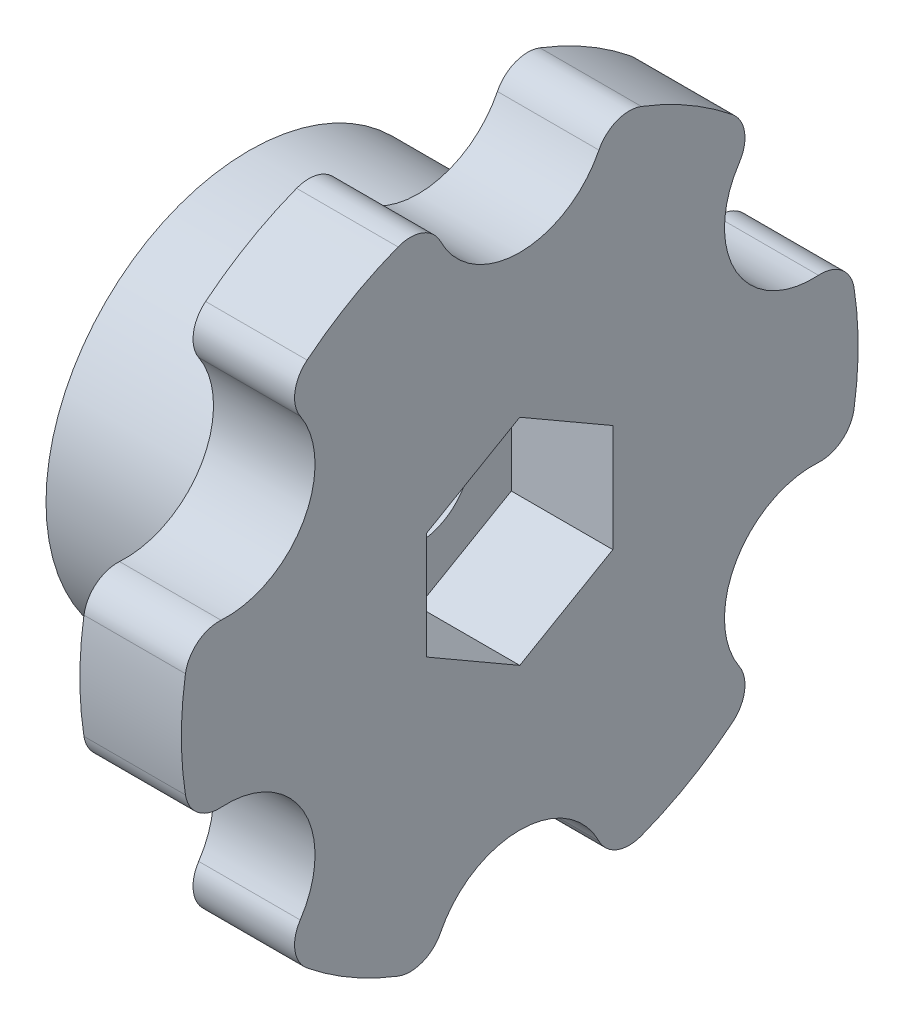
ISO-10303-21;
HEADER;
FILE_DESCRIPTION(('STEP AP214'),'2;1');
FILE_NAME('part.step','',(''),(''),'','','');
FILE_SCHEMA(('AUTOMOTIVE_DESIGN { 1 0 10303 214 1 1 1 1 }'));
ENDSEC;
DATA;
#1=APPLICATION_CONTEXT('core data for automotive mechanical design processes');
#2=APPLICATION_PROTOCOL_DEFINITION('international standard','automotive_design',2000,#1);
#3=PRODUCT_CONTEXT('',#1,'mechanical');
#4=PRODUCT('Part','Part','',(#3));
#5=PRODUCT_RELATED_PRODUCT_CATEGORY('part','',(#4));
#6=PRODUCT_DEFINITION_FORMATION('','',#4);
#7=PRODUCT_DEFINITION_CONTEXT('part definition',#1,'design');
#8=PRODUCT_DEFINITION('design','',#6,#7);
#9=PRODUCT_DEFINITION_SHAPE('','',#8);
#10=(LENGTH_UNIT() NAMED_UNIT(*) SI_UNIT(.MILLI.,.METRE.));
#11=(NAMED_UNIT(*) PLANE_ANGLE_UNIT() SI_UNIT($,.RADIAN.));
#12=(NAMED_UNIT(*) SI_UNIT($,.STERADIAN.) SOLID_ANGLE_UNIT());
#13=UNCERTAINTY_MEASURE_WITH_UNIT(LENGTH_MEASURE(1.E-05),#10,'distance_accuracy_value','');
#14=(GEOMETRIC_REPRESENTATION_CONTEXT(3) GLOBAL_UNCERTAINTY_ASSIGNED_CONTEXT((#13)) GLOBAL_UNIT_ASSIGNED_CONTEXT((#10,
#11,#12)) REPRESENTATION_CONTEXT('',''));
#15=CARTESIAN_POINT('',(0.,0.,0.));
#16=DIRECTION('',(0.,0.,1.));
#17=DIRECTION('',(1.,0.,0.));
#18=AXIS2_PLACEMENT_3D('',#15,#16,#17);
#19=CARTESIAN_POINT('',(8.,0.,0.));
#20=DIRECTION('',(-1.,0.,0.));
#21=DIRECTION('',(0.,0.,1.));
#22=AXIS2_PLACEMENT_3D('',#19,#20,#21);
#23=CYLINDRICAL_SURFACE('',#22,1.55);
#24=CARTESIAN_POINT('',(0.,0.,0.));
#25=DIRECTION('',(-1.,0.,0.));
#26=DIRECTION('',(0.,0.,1.));
#27=AXIS2_PLACEMENT_3D('',#24,#25,#26);
#28=CIRCLE('',#27,1.55);
#29=CARTESIAN_POINT('',(0.,0.,1.55));
#30=VERTEX_POINT('',#29);
#31=EDGE_CURVE('E307',#30,#30,#28,.T.);
#32=ORIENTED_EDGE('',*,*,#31,.T.);
#33=EDGE_LOOP('',(#32));
#34=FACE_BOUND('',#33,.T.);
#35=CARTESIAN_POINT('',(5.,0.,0.));
#36=DIRECTION('',(1.,0.,0.));
#37=DIRECTION('',(0.,0.,-1.));
#38=AXIS2_PLACEMENT_3D('',#35,#36,#37);
#39=CIRCLE('',#38,1.55);
#40=CARTESIAN_POINT('',(5.,0.,-1.55));
#41=VERTEX_POINT('',#40);
#42=EDGE_CURVE('E40',#41,#41,#39,.F.);
#43=ORIENTED_EDGE('',*,*,#42,.F.);
#44=EDGE_LOOP('',(#43));
#45=FACE_BOUND('',#44,.T.);
#46=ADVANCED_FACE('F36',(#34,#45),#23,.F.);
#47=CARTESIAN_POINT('',(0.,0.,0.));
#48=DIRECTION('',(-1.,0.,0.));
#49=DIRECTION('',(0.,0.,1.));
#50=AXIS2_PLACEMENT_3D('',#47,#48,#49);
#51=CYLINDRICAL_SURFACE('',#50,10.);
#52=CARTESIAN_POINT('',(8.,0.,0.));
#53=DIRECTION('',(-1.,0.,0.));
#54=DIRECTION('',(0.,0.,1.));
#55=AXIS2_PLACEMENT_3D('',#52,#53,#54);
#56=CIRCLE('',#55,10.);
#57=CARTESIAN_POINT('',(8.,1.55205912768914,-9.87882141068239));
#58=VERTEX_POINT('',#57);
#59=CARTESIAN_POINT('',(8.,-1.55205912768826,-9.87882141068253));
#60=VERTEX_POINT('',#59);
#61=EDGE_CURVE('E324',#58,#60,#56,.T.);
#62=ORIENTED_EDGE('',*,*,#61,.T.);
#63=DIRECTION('',(-1.,0.,0.));
#64=VECTOR('',#63,1.);
#65=CARTESIAN_POINT('',(0.,-1.55205912768826,-9.87882141068253));
#66=LINE('',#65,#64);
#67=CARTESIAN_POINT('',(5.,-1.55205912768826,-9.87882141068253));
#68=VERTEX_POINT('',#67);
#69=EDGE_CURVE('E439',#60,#68,#66,.T.);
#70=ORIENTED_EDGE('',*,*,#69,.T.);
#71=CARTESIAN_POINT('',(5.,0.,0.));
#72=DIRECTION('',(-1.,0.,0.));
#73=DIRECTION('',(0.,0.,1.));
#74=AXIS2_PLACEMENT_3D('',#71,#72,#73);
#75=CIRCLE('',#74,10.);
#76=CARTESIAN_POINT('',(5.,1.55205912768914,-9.87882141068239));
#77=VERTEX_POINT('',#76);
#78=EDGE_CURVE('E474',#77,#68,#75,.T.);
#79=ORIENTED_EDGE('',*,*,#78,.F.);
#80=DIRECTION('',(-1.,0.,0.));
#81=VECTOR('',#80,1.);
#82=CARTESIAN_POINT('',(0.,1.55205912768914,-9.87882141068239));
#83=LINE('',#82,#81);
#84=EDGE_CURVE('E436',#77,#58,#83,.F.);
#85=ORIENTED_EDGE('',*,*,#84,.T.);
#86=EDGE_LOOP('',(#62,#70,#79,#85));
#87=FACE_BOUND('',#86,.T.);
#88=ADVANCED_FACE('F518',(#87),#51,.T.);
#89=CARTESIAN_POINT('',(8.,-7.77928073725603,-6.28353333809547));
#90=VERTEX_POINT('',#89);
#91=CARTESIAN_POINT('',(8.,-9.33133986494464,-3.5952880725882));
#92=VERTEX_POINT('',#91);
#93=EDGE_CURVE('E321',#90,#92,#56,.T.);
#94=ORIENTED_EDGE('',*,*,#93,.T.);
#95=DIRECTION('',(-1.,0.,0.));
#96=VECTOR('',#95,1.);
#97=CARTESIAN_POINT('',(0.,-9.33133986494464,-3.5952880725882));
#98=LINE('',#97,#96);
#99=CARTESIAN_POINT('',(5.,-9.33133986494464,-3.5952880725882));
#100=VERTEX_POINT('',#99);
#101=EDGE_CURVE('E429',#92,#100,#98,.T.);
#102=ORIENTED_EDGE('',*,*,#101,.T.);
#103=CARTESIAN_POINT('',(5.,-7.77928073725603,-6.28353333809547));
#104=VERTEX_POINT('',#103);
#105=EDGE_CURVE('E476',#104,#100,#75,.T.);
#106=ORIENTED_EDGE('',*,*,#105,.F.);
#107=DIRECTION('',(-1.,0.,0.));
#108=VECTOR('',#107,1.);
#109=CARTESIAN_POINT('',(0.,-7.77928073725603,-6.28353333809547));
#110=LINE('',#109,#108);
#111=EDGE_CURVE('E426',#104,#90,#110,.F.);
#112=ORIENTED_EDGE('',*,*,#111,.T.);
#113=EDGE_LOOP('',(#94,#102,#106,#112));
#114=FACE_BOUND('',#113,.T.);
#115=ADVANCED_FACE('F503',(#114),#51,.T.);
#116=CARTESIAN_POINT('',(8.,-9.33133986494504,3.59528807258715));
#117=VERTEX_POINT('',#116);
#118=CARTESIAN_POINT('',(8.,-7.77928073725685,6.28353333809446));
#119=VERTEX_POINT('',#118);
#120=EDGE_CURVE('E325',#117,#119,#56,.T.);
#121=ORIENTED_EDGE('',*,*,#120,.T.);
#122=DIRECTION('',(-1.,0.,0.));
#123=VECTOR('',#122,1.);
#124=CARTESIAN_POINT('',(0.,-7.77928073725686,6.28353333809446));
#125=LINE('',#124,#123);
#126=CARTESIAN_POINT('',(5.,-7.77928073725685,6.28353333809446));
#127=VERTEX_POINT('',#126);
#128=EDGE_CURVE('E419',#119,#127,#125,.T.);
#129=ORIENTED_EDGE('',*,*,#128,.T.);
#130=CARTESIAN_POINT('',(5.,-9.33133986494505,3.59528807258715));
#131=VERTEX_POINT('',#130);
#132=EDGE_CURVE('E319',#131,#127,#75,.T.);
#133=ORIENTED_EDGE('',*,*,#132,.F.);
#134=DIRECTION('',(-1.,0.,0.));
#135=VECTOR('',#134,1.);
#136=CARTESIAN_POINT('',(0.,-9.33133986494505,3.59528807258715));
#137=LINE('',#136,#135);
#138=EDGE_CURVE('E416',#131,#117,#137,.F.);
#139=ORIENTED_EDGE('',*,*,#138,.T.);
#140=EDGE_LOOP('',(#121,#129,#133,#139));
#141=FACE_BOUND('',#140,.T.);
#142=ADVANCED_FACE('F487',(#141),#51,.T.);
#143=CARTESIAN_POINT('',(8.,-1.55205912768865,9.87882141068247));
#144=VERTEX_POINT('',#143);
#145=CARTESIAN_POINT('',(8.,1.55205912768835,9.87882141068252));
#146=VERTEX_POINT('',#145);
#147=EDGE_CURVE('E463',#144,#146,#56,.T.);
#148=ORIENTED_EDGE('',*,*,#147,.T.);
#149=DIRECTION('',(-1.,0.,0.));
#150=VECTOR('',#149,1.);
#151=CARTESIAN_POINT('',(0.,1.55205912768835,9.87882141068252));
#152=LINE('',#151,#150);
#153=CARTESIAN_POINT('',(5.,1.55205912768835,9.87882141068252));
#154=VERTEX_POINT('',#153);
#155=EDGE_CURVE('E409',#146,#154,#152,.T.);
#156=ORIENTED_EDGE('',*,*,#155,.T.);
#157=CARTESIAN_POINT('',(5.,-1.55205912768865,9.87882141068247));
#158=VERTEX_POINT('',#157);
#159=EDGE_CURVE('E316',#158,#154,#75,.T.);
#160=ORIENTED_EDGE('',*,*,#159,.F.);
#161=DIRECTION('',(-1.,0.,0.));
#162=VECTOR('',#161,1.);
#163=CARTESIAN_POINT('',(0.,-1.55205912768865,9.87882141068247));
#164=LINE('',#163,#162);
#165=EDGE_CURVE('E406',#158,#144,#164,.F.);
#166=ORIENTED_EDGE('',*,*,#165,.T.);
#167=EDGE_LOOP('',(#148,#156,#160,#166));
#168=FACE_BOUND('',#167,.T.);
#169=ADVANCED_FACE('F712',(#168),#51,.T.);
#170=CARTESIAN_POINT('',(8.,7.77928073725632,6.28353333809511));
#171=VERTEX_POINT('',#170);
#172=CARTESIAN_POINT('',(8.,9.33133986494509,3.59528807258704));
#173=VERTEX_POINT('',#172);
#174=EDGE_CURVE('E326',#171,#173,#56,.T.);
#175=ORIENTED_EDGE('',*,*,#174,.T.);
#176=DIRECTION('',(-1.,0.,0.));
#177=VECTOR('',#176,1.);
#178=CARTESIAN_POINT('',(0.,9.33133986494509,3.59528807258704));
#179=LINE('',#178,#177);
#180=CARTESIAN_POINT('',(5.,9.33133986494509,3.59528807258704));
#181=VERTEX_POINT('',#180);
#182=EDGE_CURVE('E348',#173,#181,#179,.T.);
#183=ORIENTED_EDGE('',*,*,#182,.T.);
#184=CARTESIAN_POINT('',(5.,7.77928073725632,6.28353333809512));
#185=VERTEX_POINT('',#184);
#186=EDGE_CURVE('E320',#185,#181,#75,.T.);
#187=ORIENTED_EDGE('',*,*,#186,.F.);
#188=DIRECTION('',(-1.,0.,0.));
#189=VECTOR('',#188,1.);
#190=CARTESIAN_POINT('',(0.,7.77928073725632,6.28353333809512));
#191=LINE('',#190,#189);
#192=EDGE_CURVE('E345',#185,#171,#191,.F.);
#193=ORIENTED_EDGE('',*,*,#192,.T.);
#194=EDGE_LOOP('',(#175,#183,#187,#193));
#195=FACE_BOUND('',#194,.T.);
#196=ADVANCED_FACE('F557',(#195),#51,.T.);
#197=CARTESIAN_POINT('',(0.,6.,0.));
#198=DIRECTION('',(1.,0.,0.));
#199=DIRECTION('',(0.,0.,-1.));
#200=AXIS2_PLACEMENT_3D('',#197,#198,#199);
#201=PLANE('',#200);
#202=ORIENTED_EDGE('',*,*,#31,.F.);
#203=EDGE_LOOP('',(#202));
#204=FACE_BOUND('',#203,.T.);
#205=CARTESIAN_POINT('',(0.,0.,0.));
#206=DIRECTION('',(-1.,0.,0.));
#207=DIRECTION('',(0.,0.,1.));
#208=AXIS2_PLACEMENT_3D('',#205,#206,#207);
#209=CIRCLE('',#208,6.);
#210=CARTESIAN_POINT('',(0.,0.,6.));
#211=VERTEX_POINT('',#210);
#212=EDGE_CURVE('E310',#211,#211,#209,.T.);
#213=ORIENTED_EDGE('',*,*,#212,.T.);
#214=EDGE_LOOP('',(#213));
#215=FACE_BOUND('',#214,.T.);
#216=ADVANCED_FACE('F560',(#204,#215),#201,.F.);
#217=CARTESIAN_POINT('',(8.,0.,0.));
#218=DIRECTION('',(-1.,0.,0.));
#219=DIRECTION('',(0.,0.,1.));
#220=AXIS2_PLACEMENT_3D('',#217,#218,#219);
#221=PLANE('',#220);
#222=DIRECTION('',(0.,0.499999999999999,0.866025403784439));
#223=VECTOR('',#222,1.);
#224=CARTESIAN_POINT('',(8.,1.5875,-2.74963065701559));
#225=LINE('',#224,#223);
#226=CARTESIAN_POINT('',(8.,1.5875,-2.74963065701559));
#227=VERTEX_POINT('',#226);
#228=CARTESIAN_POINT('',(8.,3.175,0.));
#229=VERTEX_POINT('',#228);
#230=EDGE_CURVE('E271',#227,#229,#225,.T.);
#231=ORIENTED_EDGE('',*,*,#230,.F.);
#232=DIRECTION('',(0.,1.,0.));
#233=VECTOR('',#232,1.);
#234=CARTESIAN_POINT('',(8.,-1.5875,-2.74963065701559));
#235=LINE('',#234,#233);
#236=CARTESIAN_POINT('',(8.,-1.5875,-2.74963065701559));
#237=VERTEX_POINT('',#236);
#238=EDGE_CURVE('E52',#237,#227,#235,.T.);
#239=ORIENTED_EDGE('',*,*,#238,.F.);
#240=DIRECTION('',(0.,0.500000000000001,-0.866025403784438));
#241=VECTOR('',#240,1.);
#242=CARTESIAN_POINT('',(8.,-3.175,0.));
#243=LINE('',#242,#241);
#244=CARTESIAN_POINT('',(8.,-3.175,0.));
#245=VERTEX_POINT('',#244);
#246=EDGE_CURVE('E257',#245,#237,#243,.T.);
#247=ORIENTED_EDGE('',*,*,#246,.F.);
#248=DIRECTION('',(0.,-0.499999999999999,-0.866025403784439));
#249=VECTOR('',#248,1.);
#250=CARTESIAN_POINT('',(8.,-1.5875,2.74963065701559));
#251=LINE('',#250,#249);
#252=CARTESIAN_POINT('',(8.,-1.5875,2.74963065701559));
#253=VERTEX_POINT('',#252);
#254=EDGE_CURVE('E260',#253,#245,#251,.T.);
#255=ORIENTED_EDGE('',*,*,#254,.F.);
#256=DIRECTION('',(0.,-1.,0.));
#257=VECTOR('',#256,1.);
#258=CARTESIAN_POINT('',(8.,1.5875,2.74963065701559));
#259=LINE('',#258,#257);
#260=CARTESIAN_POINT('',(8.,1.5875,2.74963065701559));
#261=VERTEX_POINT('',#260);
#262=EDGE_CURVE('E276',#261,#253,#259,.T.);
#263=ORIENTED_EDGE('',*,*,#262,.F.);
#264=DIRECTION('',(0.,-0.500000000000001,0.866025403784438));
#265=VECTOR('',#264,1.);
#266=CARTESIAN_POINT('',(8.,3.175,0.));
#267=LINE('',#266,#265);
#268=EDGE_CURVE('E273',#229,#261,#267,.T.);
#269=ORIENTED_EDGE('',*,*,#268,.F.);
#270=EDGE_LOOP('',(#231,#239,#247,#255,#263,#269));
#271=FACE_BOUND('',#270,.T.);
#272=CARTESIAN_POINT('',(8.,10.,0.));
#273=DIRECTION('',(1.,0.,0.));
#274=DIRECTION('',(0.,0.,-1.));
#275=AXIS2_PLACEMENT_3D('',#272,#273,#274);
#276=CIRCLE('',#275,2.61052384440104);
#277=CARTESIAN_POINT('',(8.,8.84185178430254,2.33955710609149));
#278=VERTEX_POINT('',#277);
#279=CARTESIAN_POINT('',(8.,8.84185178430254,-2.33955710609149));
#280=VERTEX_POINT('',#279);
#281=EDGE_CURVE('E297',#278,#280,#276,.T.);
#282=ORIENTED_EDGE('',*,*,#281,.F.);
#283=CARTESIAN_POINT('',(8.,8.39820587845058,3.23575926532834));
#284=DIRECTION('',(-1.,0.,0.));
#285=DIRECTION('',(0.,0.,1.));
#286=AXIS2_PLACEMENT_3D('',#283,#284,#285);
#287=CIRCLE('',#286,1.);
#288=EDGE_CURVE('E400',#278,#173,#287,.F.);
#289=ORIENTED_EDGE('',*,*,#288,.T.);
#290=ORIENTED_EDGE('',*,*,#174,.F.);
#291=CARTESIAN_POINT('',(8.,7.00135266353069,5.65518000428561));
#292=DIRECTION('',(-1.,0.,0.));
#293=DIRECTION('',(0.,0.,1.));
#294=AXIS2_PLACEMENT_3D('',#291,#292,#293);
#295=CIRCLE('',#294,1.);
#296=CARTESIAN_POINT('',(8.,6.44704177963102,6.48748970865674));
#297=VERTEX_POINT('',#296);
#298=EDGE_CURVE('E398',#171,#297,#295,.F.);
#299=ORIENTED_EDGE('',*,*,#298,.T.);
#300=CARTESIAN_POINT('',(8.,4.99999999999975,8.66025403784425));
#301=DIRECTION('',(1.,0.,0.));
#302=DIRECTION('',(0.,0.,-1.));
#303=AXIS2_PLACEMENT_3D('',#300,#301,#302);
#304=CIRCLE('',#303,2.61052384440137);
#305=CARTESIAN_POINT('',(8.,2.39481000467107,8.82704681474855));
#306=VERTEX_POINT('',#305);
#307=EDGE_CURVE('E290',#306,#297,#304,.T.);
#308=ORIENTED_EDGE('',*,*,#307,.F.);
#309=CARTESIAN_POINT('',(8.,1.39685321491951,8.89093926961426));
#310=DIRECTION('',(-1.,0.,0.));
#311=DIRECTION('',(0.,0.,1.));
#312=AXIS2_PLACEMENT_3D('',#309,#310,#311);
#313=CIRCLE('',#312,1.);
#314=EDGE_CURVE('E396',#306,#146,#313,.F.);
#315=ORIENTED_EDGE('',*,*,#314,.T.);
#316=ORIENTED_EDGE('',*,*,#147,.F.);
#317=CARTESIAN_POINT('',(8.,-1.39685321491979,8.89093926961422));
#318=DIRECTION('',(-1.,0.,0.));
#319=DIRECTION('',(0.,0.,1.));
#320=AXIS2_PLACEMENT_3D('',#317,#318,#319);
#321=CIRCLE('',#320,1.);
#322=CARTESIAN_POINT('',(8.,-2.39481000467134,8.82704681474844));
#323=VERTEX_POINT('',#322);
#324=EDGE_CURVE('E394',#144,#323,#321,.F.);
#325=ORIENTED_EDGE('',*,*,#324,.T.);
#326=CARTESIAN_POINT('',(8.,-5.00000000000025,8.66025403784396));
#327=DIRECTION('',(1.,0.,0.));
#328=DIRECTION('',(0.,0.,-1.));
#329=AXIS2_PLACEMENT_3D('',#326,#327,#328);
#330=CIRCLE('',#329,2.61052384440161);
#331=CARTESIAN_POINT('',(8.,-6.44704177963154,6.48748970865618));
#332=VERTEX_POINT('',#331);
#333=EDGE_CURVE('E293',#332,#323,#330,.T.);
#334=ORIENTED_EDGE('',*,*,#333,.F.);
#335=CARTESIAN_POINT('',(8.,-7.00135266353117,5.65518000428501));
#336=DIRECTION('',(-1.,0.,0.));
#337=DIRECTION('',(0.,0.,1.));
#338=AXIS2_PLACEMENT_3D('',#335,#336,#337);
#339=CIRCLE('',#338,1.);
#340=EDGE_CURVE('E392',#332,#119,#339,.F.);
#341=ORIENTED_EDGE('',*,*,#340,.T.);
#342=ORIENTED_EDGE('',*,*,#120,.F.);
#343=CARTESIAN_POINT('',(8.,-8.39820587845054,3.23575926532843));
#344=DIRECTION('',(-1.,0.,0.));
#345=DIRECTION('',(0.,0.,1.));
#346=AXIS2_PLACEMENT_3D('',#343,#344,#345);
#347=CIRCLE('',#346,1.);
#348=CARTESIAN_POINT('',(8.,-8.84185178430244,2.33955710609155));
#349=VERTEX_POINT('',#348);
#350=EDGE_CURVE('E390',#117,#349,#347,.F.);
#351=ORIENTED_EDGE('',*,*,#350,.T.);
#352=CARTESIAN_POINT('',(8.,-10.,-5.65984895009786E-13));
#353=DIRECTION('',(1.,0.,0.));
#354=DIRECTION('',(0.,0.,-1.));
#355=AXIS2_PLACEMENT_3D('',#352,#353,#354);
#356=CIRCLE('',#355,2.61052384440165);
#357=CARTESIAN_POINT('',(8.,-8.84185178430218,-2.33955710609255));
#358=VERTEX_POINT('',#357);
#359=EDGE_CURVE('E300',#358,#349,#356,.T.);
#360=ORIENTED_EDGE('',*,*,#359,.F.);
#361=CARTESIAN_POINT('',(8.,-8.39820587845017,-3.23575926532938));
#362=DIRECTION('',(-1.,0.,0.));
#363=DIRECTION('',(0.,0.,1.));
#364=AXIS2_PLACEMENT_3D('',#361,#362,#363);
#365=CIRCLE('',#364,1.);
#366=EDGE_CURVE('E388',#358,#92,#365,.F.);
#367=ORIENTED_EDGE('',*,*,#366,.T.);
#368=ORIENTED_EDGE('',*,*,#93,.F.);
#369=CARTESIAN_POINT('',(8.,-7.00135266353043,-5.65518000428593));
#370=DIRECTION('',(-1.,0.,0.));
#371=DIRECTION('',(0.,0.,1.));
#372=AXIS2_PLACEMENT_3D('',#369,#370,#371);
#373=CIRCLE('',#372,1.);
#374=CARTESIAN_POINT('',(8.,-6.44704177963085,-6.48748970865712));
#375=VERTEX_POINT('',#374);
#376=EDGE_CURVE('E60',#90,#375,#373,.F.);
#377=ORIENTED_EDGE('',*,*,#376,.T.);
#378=CARTESIAN_POINT('',(8.,-4.99999999999975,-8.66025403784481));
#379=DIRECTION('',(1.,0.,0.));
#380=DIRECTION('',(0.,0.,-1.));
#381=AXIS2_PLACEMENT_3D('',#378,#379,#380);
#382=CIRCLE('',#381,2.61052384440142);
#383=CARTESIAN_POINT('',(8.,-2.394810004671,-8.82704681474871));
#384=VERTEX_POINT('',#383);
#385=EDGE_CURVE('E298',#384,#375,#382,.T.);
#386=ORIENTED_EDGE('',*,*,#385,.F.);
#387=CARTESIAN_POINT('',(8.,-1.39685321491943,-8.89093926961428));
#388=DIRECTION('',(-1.,0.,0.));
#389=DIRECTION('',(0.,0.,1.));
#390=AXIS2_PLACEMENT_3D('',#387,#388,#389);
#391=CIRCLE('',#390,1.);
#392=EDGE_CURVE('E385',#384,#60,#391,.F.);
#393=ORIENTED_EDGE('',*,*,#392,.T.);
#394=ORIENTED_EDGE('',*,*,#61,.F.);
#395=CARTESIAN_POINT('',(8.,1.39685321492023,-8.89093926961415));
#396=DIRECTION('',(-1.,0.,0.));
#397=DIRECTION('',(0.,0.,1.));
#398=AXIS2_PLACEMENT_3D('',#395,#396,#397);
#399=CIRCLE('',#398,1.);
#400=CARTESIAN_POINT('',(8.,2.39481000467179,-8.82704681474854));
#401=VERTEX_POINT('',#400);
#402=EDGE_CURVE('E383',#58,#401,#399,.F.);
#403=ORIENTED_EDGE('',*,*,#402,.T.);
#404=CARTESIAN_POINT('',(8.,5.00000000000025,-8.66025403784453));
#405=DIRECTION('',(1.,0.,0.));
#406=DIRECTION('',(0.,0.,-1.));
#407=AXIS2_PLACEMENT_3D('',#404,#405,#406);
#408=CIRCLE('',#407,2.61052384440113);
#409=CARTESIAN_POINT('',(8.,6.44704177963104,-6.48748970865698));
#410=VERTEX_POINT('',#409);
#411=EDGE_CURVE('E294',#410,#401,#408,.T.);
#412=ORIENTED_EDGE('',*,*,#411,.F.);
#413=CARTESIAN_POINT('',(8.,7.00135266353057,-5.65518000428576));
#414=DIRECTION('',(-1.,0.,0.));
#415=DIRECTION('',(0.,0.,1.));
#416=AXIS2_PLACEMENT_3D('',#413,#414,#415);
#417=CIRCLE('',#416,1.);
#418=CARTESIAN_POINT('',(8.,7.77928073725619,-6.28353333809528));
#419=VERTEX_POINT('',#418);
#420=EDGE_CURVE('E381',#410,#419,#417,.F.);
#421=ORIENTED_EDGE('',*,*,#420,.T.);
#422=CARTESIAN_POINT('',(8.,9.33133986494509,-3.59528807258704));
#423=VERTEX_POINT('',#422);
#424=EDGE_CURVE('E453',#423,#419,#56,.T.);
#425=ORIENTED_EDGE('',*,*,#424,.F.);
#426=CARTESIAN_POINT('',(8.,8.39820587845058,-3.23575926532834));
#427=DIRECTION('',(-1.,0.,0.));
#428=DIRECTION('',(0.,0.,1.));
#429=AXIS2_PLACEMENT_3D('',#426,#427,#428);
#430=CIRCLE('',#429,1.);
#431=EDGE_CURVE('E379',#423,#280,#430,.F.);
#432=ORIENTED_EDGE('',*,*,#431,.T.);
#433=EDGE_LOOP('',(#282,#289,#290,#299,#308,#315,#316,#325,#334,#341,#342,#351,#360,#367,#368,
#377,#386,#393,#394,#403,#412,#421,#425,#432));
#434=FACE_BOUND('',#433,.T.);
#435=ADVANCED_FACE('F460',(#271,#434),#221,.F.);
#436=ORIENTED_EDGE('',*,*,#424,.T.);
#437=DIRECTION('',(-1.,0.,0.));
#438=VECTOR('',#437,1.);
#439=CARTESIAN_POINT('',(0.,7.77928073725619,-6.28353333809528));
#440=LINE('',#439,#438);
#441=CARTESIAN_POINT('',(5.,7.77928073725619,-6.28353333809529));
#442=VERTEX_POINT('',#441);
#443=EDGE_CURVE('E11',#419,#442,#440,.T.);
#444=ORIENTED_EDGE('',*,*,#443,.T.);
#445=CARTESIAN_POINT('',(5.,9.33133986494509,-3.59528807258704));
#446=VERTEX_POINT('',#445);
#447=EDGE_CURVE('E456',#446,#442,#75,.T.);
#448=ORIENTED_EDGE('',*,*,#447,.F.);
#449=DIRECTION('',(-1.,0.,0.));
#450=VECTOR('',#449,1.);
#451=CARTESIAN_POINT('',(0.,9.33133986494509,-3.59528807258704));
#452=LINE('',#451,#450);
#453=EDGE_CURVE('E45',#446,#423,#452,.F.);
#454=ORIENTED_EDGE('',*,*,#453,.T.);
#455=EDGE_LOOP('',(#436,#444,#448,#454));
#456=FACE_BOUND('',#455,.T.);
#457=ADVANCED_FACE('F452',(#456),#51,.T.);
#458=CARTESIAN_POINT('',(5.,10.,0.));
#459=DIRECTION('',(1.,0.,0.));
#460=DIRECTION('',(0.,0.,-1.));
#461=AXIS2_PLACEMENT_3D('',#458,#459,#460);
#462=PLANE('',#461);
#463=CARTESIAN_POINT('',(5.,0.,0.));
#464=DIRECTION('',(-1.,0.,0.));
#465=DIRECTION('',(0.,0.,1.));
#466=AXIS2_PLACEMENT_3D('',#463,#464,#465);
#467=CIRCLE('',#466,6.);
#468=CARTESIAN_POINT('',(5.,0.,6.));
#469=VERTEX_POINT('',#468);
#470=EDGE_CURVE('E313',#469,#469,#467,.T.);
#471=ORIENTED_EDGE('',*,*,#470,.F.);
#472=EDGE_LOOP('',(#471));
#473=FACE_BOUND('',#472,.T.);
#474=ORIENTED_EDGE('',*,*,#186,.T.);
#475=CARTESIAN_POINT('',(5.,8.39820587845058,3.23575926532834));
#476=DIRECTION('',(1.,0.,0.));
#477=DIRECTION('',(0.,0.,-1.));
#478=AXIS2_PLACEMENT_3D('',#475,#476,#477);
#479=CIRCLE('',#478,1.);
#480=CARTESIAN_POINT('',(5.,8.84185178430254,2.33955710609149));
#481=VERTEX_POINT('',#480);
#482=EDGE_CURVE('E373',#181,#481,#479,.F.);
#483=ORIENTED_EDGE('',*,*,#482,.T.);
#484=CARTESIAN_POINT('',(5.,10.,0.));
#485=DIRECTION('',(1.,0.,0.));
#486=DIRECTION('',(0.,0.,-1.));
#487=AXIS2_PLACEMENT_3D('',#484,#485,#486);
#488=CIRCLE('',#487,2.61052384440104);
#489=CARTESIAN_POINT('',(5.,8.84185178430254,-2.33955710609149));
#490=VERTEX_POINT('',#489);
#491=EDGE_CURVE('E327',#481,#490,#488,.T.);
#492=ORIENTED_EDGE('',*,*,#491,.T.);
#493=CARTESIAN_POINT('',(5.,8.39820587845058,-3.23575926532834));
#494=DIRECTION('',(1.,0.,0.));
#495=DIRECTION('',(0.,0.,-1.));
#496=AXIS2_PLACEMENT_3D('',#493,#494,#495);
#497=CIRCLE('',#496,1.);
#498=EDGE_CURVE('E351',#490,#446,#497,.F.);
#499=ORIENTED_EDGE('',*,*,#498,.T.);
#500=ORIENTED_EDGE('',*,*,#447,.T.);
#501=CARTESIAN_POINT('',(5.,7.00135266353057,-5.65518000428576));
#502=DIRECTION('',(1.,0.,0.));
#503=DIRECTION('',(0.,0.,-1.));
#504=AXIS2_PLACEMENT_3D('',#501,#502,#503);
#505=CIRCLE('',#504,1.);
#506=CARTESIAN_POINT('',(5.,6.44704177963104,-6.48748970865698));
#507=VERTEX_POINT('',#506);
#508=EDGE_CURVE('E353',#442,#507,#505,.F.);
#509=ORIENTED_EDGE('',*,*,#508,.T.);
#510=CARTESIAN_POINT('',(5.,5.00000000000025,-8.66025403784453));
#511=DIRECTION('',(1.,0.,0.));
#512=DIRECTION('',(0.,0.,-1.));
#513=AXIS2_PLACEMENT_3D('',#510,#511,#512);
#514=CIRCLE('',#513,2.61052384440113);
#515=CARTESIAN_POINT('',(5.,2.39481000467179,-8.82704681474854));
#516=VERTEX_POINT('',#515);
#517=EDGE_CURVE('E342',#507,#516,#514,.T.);
#518=ORIENTED_EDGE('',*,*,#517,.T.);
#519=CARTESIAN_POINT('',(5.,1.39685321492023,-8.89093926961415));
#520=DIRECTION('',(1.,0.,0.));
#521=DIRECTION('',(0.,0.,-1.));
#522=AXIS2_PLACEMENT_3D('',#519,#520,#521);
#523=CIRCLE('',#522,1.);
#524=EDGE_CURVE('E355',#516,#77,#523,.F.);
#525=ORIENTED_EDGE('',*,*,#524,.T.);
#526=ORIENTED_EDGE('',*,*,#78,.T.);
#527=CARTESIAN_POINT('',(5.,-1.39685321491943,-8.89093926961428));
#528=DIRECTION('',(1.,0.,0.));
#529=DIRECTION('',(0.,0.,-1.));
#530=AXIS2_PLACEMENT_3D('',#527,#528,#529);
#531=CIRCLE('',#530,1.);
#532=CARTESIAN_POINT('',(5.,-2.394810004671,-8.82704681474871));
#533=VERTEX_POINT('',#532);
#534=EDGE_CURVE('E357',#68,#533,#531,.F.);
#535=ORIENTED_EDGE('',*,*,#534,.T.);
#536=CARTESIAN_POINT('',(5.,-4.99999999999975,-8.66025403784481));
#537=DIRECTION('',(1.,0.,0.));
#538=DIRECTION('',(0.,0.,-1.));
#539=AXIS2_PLACEMENT_3D('',#536,#537,#538);
#540=CIRCLE('',#539,2.61052384440142);
#541=CARTESIAN_POINT('',(5.,-6.44704177963085,-6.48748970865712));
#542=VERTEX_POINT('',#541);
#543=EDGE_CURVE('E339',#533,#542,#540,.T.);
#544=ORIENTED_EDGE('',*,*,#543,.T.);
#545=CARTESIAN_POINT('',(5.,-7.00135266353043,-5.65518000428593));
#546=DIRECTION('',(1.,0.,0.));
#547=DIRECTION('',(0.,0.,-1.));
#548=AXIS2_PLACEMENT_3D('',#545,#546,#547);
#549=CIRCLE('',#548,1.);
#550=EDGE_CURVE('E359',#542,#104,#549,.F.);
#551=ORIENTED_EDGE('',*,*,#550,.T.);
#552=ORIENTED_EDGE('',*,*,#105,.T.);
#553=CARTESIAN_POINT('',(5.,-8.39820587845017,-3.23575926532938));
#554=DIRECTION('',(1.,0.,0.));
#555=DIRECTION('',(0.,0.,-1.));
#556=AXIS2_PLACEMENT_3D('',#553,#554,#555);
#557=CIRCLE('',#556,1.);
#558=CARTESIAN_POINT('',(5.,-8.84185178430218,-2.33955710609255));
#559=VERTEX_POINT('',#558);
#560=EDGE_CURVE('E361',#100,#559,#557,.F.);
#561=ORIENTED_EDGE('',*,*,#560,.T.);
#562=CARTESIAN_POINT('',(5.,-10.,-5.65984895009786E-13));
#563=DIRECTION('',(1.,0.,0.));
#564=DIRECTION('',(0.,0.,-1.));
#565=AXIS2_PLACEMENT_3D('',#562,#563,#564);
#566=CIRCLE('',#565,2.61052384440165);
#567=CARTESIAN_POINT('',(5.,-8.84185178430244,2.33955710609155));
#568=VERTEX_POINT('',#567);
#569=EDGE_CURVE('E336',#559,#568,#566,.T.);
#570=ORIENTED_EDGE('',*,*,#569,.T.);
#571=CARTESIAN_POINT('',(5.,-8.39820587845054,3.23575926532843));
#572=DIRECTION('',(1.,0.,0.));
#573=DIRECTION('',(0.,0.,-1.));
#574=AXIS2_PLACEMENT_3D('',#571,#572,#573);
#575=CIRCLE('',#574,1.);
#576=EDGE_CURVE('E363',#568,#131,#575,.F.);
#577=ORIENTED_EDGE('',*,*,#576,.T.);
#578=ORIENTED_EDGE('',*,*,#132,.T.);
#579=CARTESIAN_POINT('',(5.,-7.00135266353117,5.65518000428501));
#580=DIRECTION('',(1.,0.,0.));
#581=DIRECTION('',(0.,0.,-1.));
#582=AXIS2_PLACEMENT_3D('',#579,#580,#581);
#583=CIRCLE('',#582,1.);
#584=CARTESIAN_POINT('',(5.,-6.44704177963154,6.48748970865618));
#585=VERTEX_POINT('',#584);
#586=EDGE_CURVE('E365',#127,#585,#583,.F.);
#587=ORIENTED_EDGE('',*,*,#586,.T.);
#588=CARTESIAN_POINT('',(5.,-5.00000000000025,8.66025403784396));
#589=DIRECTION('',(1.,0.,0.));
#590=DIRECTION('',(0.,0.,-1.));
#591=AXIS2_PLACEMENT_3D('',#588,#589,#590);
#592=CIRCLE('',#591,2.61052384440161);
#593=CARTESIAN_POINT('',(5.,-2.39481000467134,8.82704681474844));
#594=VERTEX_POINT('',#593);
#595=EDGE_CURVE('E333',#585,#594,#592,.T.);
#596=ORIENTED_EDGE('',*,*,#595,.T.);
#597=CARTESIAN_POINT('',(5.,-1.39685321491979,8.89093926961422));
#598=DIRECTION('',(1.,0.,0.));
#599=DIRECTION('',(0.,0.,-1.));
#600=AXIS2_PLACEMENT_3D('',#597,#598,#599);
#601=CIRCLE('',#600,1.);
#602=EDGE_CURVE('E367',#594,#158,#601,.F.);
#603=ORIENTED_EDGE('',*,*,#602,.T.);
#604=ORIENTED_EDGE('',*,*,#159,.T.);
#605=CARTESIAN_POINT('',(5.,1.39685321491951,8.89093926961426));
#606=DIRECTION('',(1.,0.,0.));
#607=DIRECTION('',(0.,0.,-1.));
#608=AXIS2_PLACEMENT_3D('',#605,#606,#607);
#609=CIRCLE('',#608,1.);
#610=CARTESIAN_POINT('',(5.,2.39481000467107,8.82704681474855));
#611=VERTEX_POINT('',#610);
#612=EDGE_CURVE('E369',#154,#611,#609,.F.);
#613=ORIENTED_EDGE('',*,*,#612,.T.);
#614=CARTESIAN_POINT('',(5.,4.99999999999975,8.66025403784425));
#615=DIRECTION('',(1.,0.,0.));
#616=DIRECTION('',(0.,0.,-1.));
#617=AXIS2_PLACEMENT_3D('',#614,#615,#616);
#618=CIRCLE('',#617,2.61052384440137);
#619=CARTESIAN_POINT('',(5.,6.44704177963102,6.48748970865674));
#620=VERTEX_POINT('',#619);
#621=EDGE_CURVE('E330',#611,#620,#618,.T.);
#622=ORIENTED_EDGE('',*,*,#621,.T.);
#623=CARTESIAN_POINT('',(5.,7.00135266353069,5.65518000428561));
#624=DIRECTION('',(1.,0.,0.));
#625=DIRECTION('',(0.,0.,-1.));
#626=AXIS2_PLACEMENT_3D('',#623,#624,#625);
#627=CIRCLE('',#626,1.);
#628=EDGE_CURVE('E371',#620,#185,#627,.F.);
#629=ORIENTED_EDGE('',*,*,#628,.T.);
#630=EDGE_LOOP('',(#474,#483,#492,#499,#500,#509,#518,#525,#526,#535,#544,#551,#552,#561,#570,
#577,#578,#587,#596,#603,#604,#613,#622,#629));
#631=FACE_BOUND('',#630,.T.);
#632=ADVANCED_FACE('F482',(#473,#631),#462,.F.);
#633=CARTESIAN_POINT('',(0.,0.,0.));
#634=DIRECTION('',(-1.,0.,0.));
#635=DIRECTION('',(0.,0.,1.));
#636=AXIS2_PLACEMENT_3D('',#633,#634,#635);
#637=CYLINDRICAL_SURFACE('',#636,6.);
#638=ORIENTED_EDGE('',*,*,#212,.F.);
#639=EDGE_LOOP('',(#638));
#640=FACE_BOUND('',#639,.T.);
#641=ORIENTED_EDGE('',*,*,#470,.T.);
#642=EDGE_LOOP('',(#641));
#643=FACE_BOUND('',#642,.T.);
#644=ADVANCED_FACE('F549',(#640,#643),#637,.T.);
#645=CARTESIAN_POINT('',(0.,10.,0.));
#646=DIRECTION('',(1.,0.,0.));
#647=DIRECTION('',(0.,0.,-1.));
#648=AXIS2_PLACEMENT_3D('',#645,#646,#647);
#649=CYLINDRICAL_SURFACE('',#648,2.61052384440104);
#650=ORIENTED_EDGE('',*,*,#491,.F.);
#651=DIRECTION('',(1.,0.,0.));
#652=VECTOR('',#651,1.);
#653=CARTESIAN_POINT('',(0.,8.84185178430254,2.33955710609149));
#654=LINE('',#653,#652);
#655=EDGE_CURVE('E377',#481,#278,#654,.T.);
#656=ORIENTED_EDGE('',*,*,#655,.T.);
#657=ORIENTED_EDGE('',*,*,#281,.T.);
#658=DIRECTION('',(1.,0.,0.));
#659=VECTOR('',#658,1.);
#660=CARTESIAN_POINT('',(0.,8.84185178430254,-2.33955710609149));
#661=LINE('',#660,#659);
#662=EDGE_CURVE('E375',#280,#490,#661,.F.);
#663=ORIENTED_EDGE('',*,*,#662,.T.);
#664=EDGE_LOOP('',(#650,#656,#657,#663));
#665=FACE_BOUND('',#664,.T.);
#666=ADVANCED_FACE('F547',(#665),#649,.F.);
#667=CARTESIAN_POINT('',(0.,4.99999999999975,8.66025403784425));
#668=DIRECTION('',(1.,0.,0.));
#669=DIRECTION('',(0.,0.,-1.));
#670=AXIS2_PLACEMENT_3D('',#667,#668,#669);
#671=CYLINDRICAL_SURFACE('',#670,2.61052384440137);
#672=ORIENTED_EDGE('',*,*,#307,.T.);
#673=DIRECTION('',(1.,0.,0.));
#674=VECTOR('',#673,1.);
#675=CARTESIAN_POINT('',(0.,6.44704177963102,6.48748970865674));
#676=LINE('',#675,#674);
#677=EDGE_CURVE('E404',#297,#620,#676,.F.);
#678=ORIENTED_EDGE('',*,*,#677,.T.);
#679=ORIENTED_EDGE('',*,*,#621,.F.);
#680=DIRECTION('',(1.,0.,0.));
#681=VECTOR('',#680,1.);
#682=CARTESIAN_POINT('',(0.,2.39481000467107,8.82704681474855));
#683=LINE('',#682,#681);
#684=EDGE_CURVE('E402',#611,#306,#683,.T.);
#685=ORIENTED_EDGE('',*,*,#684,.T.);
#686=EDGE_LOOP('',(#672,#678,#679,#685));
#687=FACE_BOUND('',#686,.T.);
#688=ADVANCED_FACE('F691',(#687),#671,.F.);
#689=CARTESIAN_POINT('',(0.,-5.00000000000025,8.66025403784396));
#690=DIRECTION('',(1.,0.,0.));
#691=DIRECTION('',(0.,0.,-1.));
#692=AXIS2_PLACEMENT_3D('',#689,#690,#691);
#693=CYLINDRICAL_SURFACE('',#692,2.61052384440161);
#694=ORIENTED_EDGE('',*,*,#333,.T.);
#695=DIRECTION('',(1.,0.,0.));
#696=VECTOR('',#695,1.);
#697=CARTESIAN_POINT('',(0.,-2.39481000467134,8.82704681474844));
#698=LINE('',#697,#696);
#699=EDGE_CURVE('E414',#323,#594,#698,.F.);
#700=ORIENTED_EDGE('',*,*,#699,.T.);
#701=ORIENTED_EDGE('',*,*,#595,.F.);
#702=DIRECTION('',(1.,0.,0.));
#703=VECTOR('',#702,1.);
#704=CARTESIAN_POINT('',(0.,-6.44704177963154,6.48748970865618));
#705=LINE('',#704,#703);
#706=EDGE_CURVE('E412',#585,#332,#705,.T.);
#707=ORIENTED_EDGE('',*,*,#706,.T.);
#708=EDGE_LOOP('',(#694,#700,#701,#707));
#709=FACE_BOUND('',#708,.T.);
#710=ADVANCED_FACE('F694',(#709),#693,.F.);
#711=CARTESIAN_POINT('',(0.,-10.,-5.65984895009786E-13));
#712=DIRECTION('',(1.,0.,0.));
#713=DIRECTION('',(0.,0.,-1.));
#714=AXIS2_PLACEMENT_3D('',#711,#712,#713);
#715=CYLINDRICAL_SURFACE('',#714,2.61052384440165);
#716=ORIENTED_EDGE('',*,*,#359,.T.);
#717=DIRECTION('',(1.,0.,0.));
#718=VECTOR('',#717,1.);
#719=CARTESIAN_POINT('',(0.,-8.84185178430244,2.33955710609155));
#720=LINE('',#719,#718);
#721=EDGE_CURVE('E424',#349,#568,#720,.F.);
#722=ORIENTED_EDGE('',*,*,#721,.T.);
#723=ORIENTED_EDGE('',*,*,#569,.F.);
#724=DIRECTION('',(1.,0.,0.));
#725=VECTOR('',#724,1.);
#726=CARTESIAN_POINT('',(0.,-8.84185178430218,-2.33955710609255));
#727=LINE('',#726,#725);
#728=EDGE_CURVE('E422',#559,#358,#727,.T.);
#729=ORIENTED_EDGE('',*,*,#728,.T.);
#730=EDGE_LOOP('',(#716,#722,#723,#729));
#731=FACE_BOUND('',#730,.T.);
#732=ADVANCED_FACE('F496',(#731),#715,.F.);
#733=CARTESIAN_POINT('',(0.,-4.99999999999975,-8.66025403784481));
#734=DIRECTION('',(1.,0.,0.));
#735=DIRECTION('',(0.,0.,-1.));
#736=AXIS2_PLACEMENT_3D('',#733,#734,#735);
#737=CYLINDRICAL_SURFACE('',#736,2.61052384440142);
#738=ORIENTED_EDGE('',*,*,#385,.T.);
#739=DIRECTION('',(1.,0.,0.));
#740=VECTOR('',#739,1.);
#741=CARTESIAN_POINT('',(0.,-6.44704177963085,-6.48748970865712));
#742=LINE('',#741,#740);
#743=EDGE_CURVE('E434',#375,#542,#742,.F.);
#744=ORIENTED_EDGE('',*,*,#743,.T.);
#745=ORIENTED_EDGE('',*,*,#543,.F.);
#746=DIRECTION('',(1.,0.,0.));
#747=VECTOR('',#746,1.);
#748=CARTESIAN_POINT('',(0.,-2.394810004671,-8.82704681474871));
#749=LINE('',#748,#747);
#750=EDGE_CURVE('E432',#533,#384,#749,.T.);
#751=ORIENTED_EDGE('',*,*,#750,.T.);
#752=EDGE_LOOP('',(#738,#744,#745,#751));
#753=FACE_BOUND('',#752,.T.);
#754=ADVANCED_FACE('F511',(#753),#737,.F.);
#755=CARTESIAN_POINT('',(0.,5.00000000000025,-8.66025403784453));
#756=DIRECTION('',(1.,0.,0.));
#757=DIRECTION('',(0.,0.,-1.));
#758=AXIS2_PLACEMENT_3D('',#755,#756,#757);
#759=CYLINDRICAL_SURFACE('',#758,2.61052384440113);
#760=ORIENTED_EDGE('',*,*,#411,.T.);
#761=DIRECTION('',(1.,0.,0.));
#762=VECTOR('',#761,1.);
#763=CARTESIAN_POINT('',(0.,2.39481000467179,-8.82704681474854));
#764=LINE('',#763,#762);
#765=EDGE_CURVE('E444',#401,#516,#764,.F.);
#766=ORIENTED_EDGE('',*,*,#765,.T.);
#767=ORIENTED_EDGE('',*,*,#517,.F.);
#768=DIRECTION('',(1.,0.,0.));
#769=VECTOR('',#768,1.);
#770=CARTESIAN_POINT('',(0.,6.44704177963104,-6.48748970865698));
#771=LINE('',#770,#769);
#772=EDGE_CURVE('E442',#507,#410,#771,.T.);
#773=ORIENTED_EDGE('',*,*,#772,.T.);
#774=EDGE_LOOP('',(#760,#766,#767,#773));
#775=FACE_BOUND('',#774,.T.);
#776=ADVANCED_FACE('F524',(#775),#759,.F.);
#777=CARTESIAN_POINT('',(0.,8.39820587845058,3.23575926532834));
#778=DIRECTION('',(1.,0.,0.));
#779=DIRECTION('',(0.,0.,-1.));
#780=AXIS2_PLACEMENT_3D('',#777,#778,#779);
#781=CYLINDRICAL_SURFACE('',#780,1.);
#782=ORIENTED_EDGE('',*,*,#288,.F.);
#783=ORIENTED_EDGE('',*,*,#655,.F.);
#784=ORIENTED_EDGE('',*,*,#482,.F.);
#785=ORIENTED_EDGE('',*,*,#182,.F.);
#786=EDGE_LOOP('',(#782,#783,#784,#785));
#787=FACE_BOUND('',#786,.T.);
#788=ADVANCED_FACE('F565',(#787),#781,.T.);
#789=CARTESIAN_POINT('',(0.,7.00135266353069,5.65518000428561));
#790=DIRECTION('',(-1.,0.,0.));
#791=DIRECTION('',(0.,0.,1.));
#792=AXIS2_PLACEMENT_3D('',#789,#790,#791);
#793=CYLINDRICAL_SURFACE('',#792,1.);
#794=ORIENTED_EDGE('',*,*,#628,.F.);
#795=ORIENTED_EDGE('',*,*,#677,.F.);
#796=ORIENTED_EDGE('',*,*,#298,.F.);
#797=ORIENTED_EDGE('',*,*,#192,.F.);
#798=EDGE_LOOP('',(#794,#795,#796,#797));
#799=FACE_BOUND('',#798,.T.);
#800=ADVANCED_FACE('F568',(#799),#793,.T.);
#801=CARTESIAN_POINT('',(0.,1.39685321491951,8.89093926961426));
#802=DIRECTION('',(1.,0.,0.));
#803=DIRECTION('',(0.,0.,-1.));
#804=AXIS2_PLACEMENT_3D('',#801,#802,#803);
#805=CYLINDRICAL_SURFACE('',#804,1.);
#806=ORIENTED_EDGE('',*,*,#314,.F.);
#807=ORIENTED_EDGE('',*,*,#684,.F.);
#808=ORIENTED_EDGE('',*,*,#612,.F.);
#809=ORIENTED_EDGE('',*,*,#155,.F.);
#810=EDGE_LOOP('',(#806,#807,#808,#809));
#811=FACE_BOUND('',#810,.T.);
#812=ADVANCED_FACE('F572',(#811),#805,.T.);
#813=CARTESIAN_POINT('',(0.,-1.39685321491979,8.89093926961422));
#814=DIRECTION('',(-1.,0.,0.));
#815=DIRECTION('',(0.,0.,1.));
#816=AXIS2_PLACEMENT_3D('',#813,#814,#815);
#817=CYLINDRICAL_SURFACE('',#816,1.);
#818=ORIENTED_EDGE('',*,*,#602,.F.);
#819=ORIENTED_EDGE('',*,*,#699,.F.);
#820=ORIENTED_EDGE('',*,*,#324,.F.);
#821=ORIENTED_EDGE('',*,*,#165,.F.);
#822=EDGE_LOOP('',(#818,#819,#820,#821));
#823=FACE_BOUND('',#822,.T.);
#824=ADVANCED_FACE('F576',(#823),#817,.T.);
#825=CARTESIAN_POINT('',(0.,-7.00135266353117,5.65518000428501));
#826=DIRECTION('',(1.,0.,0.));
#827=DIRECTION('',(0.,0.,-1.));
#828=AXIS2_PLACEMENT_3D('',#825,#826,#827);
#829=CYLINDRICAL_SURFACE('',#828,1.);
#830=ORIENTED_EDGE('',*,*,#340,.F.);
#831=ORIENTED_EDGE('',*,*,#706,.F.);
#832=ORIENTED_EDGE('',*,*,#586,.F.);
#833=ORIENTED_EDGE('',*,*,#128,.F.);
#834=EDGE_LOOP('',(#830,#831,#832,#833));
#835=FACE_BOUND('',#834,.T.);
#836=ADVANCED_FACE('F580',(#835),#829,.T.);
#837=CARTESIAN_POINT('',(0.,-8.39820587845054,3.23575926532843));
#838=DIRECTION('',(-1.,0.,0.));
#839=DIRECTION('',(0.,0.,1.));
#840=AXIS2_PLACEMENT_3D('',#837,#838,#839);
#841=CYLINDRICAL_SURFACE('',#840,1.);
#842=ORIENTED_EDGE('',*,*,#576,.F.);
#843=ORIENTED_EDGE('',*,*,#721,.F.);
#844=ORIENTED_EDGE('',*,*,#350,.F.);
#845=ORIENTED_EDGE('',*,*,#138,.F.);
#846=EDGE_LOOP('',(#842,#843,#844,#845));
#847=FACE_BOUND('',#846,.T.);
#848=ADVANCED_FACE('F491',(#847),#841,.T.);
#849=CARTESIAN_POINT('',(0.,-8.39820587845017,-3.23575926532938));
#850=DIRECTION('',(1.,0.,0.));
#851=DIRECTION('',(0.,0.,-1.));
#852=AXIS2_PLACEMENT_3D('',#849,#850,#851);
#853=CYLINDRICAL_SURFACE('',#852,1.);
#854=ORIENTED_EDGE('',*,*,#366,.F.);
#855=ORIENTED_EDGE('',*,*,#728,.F.);
#856=ORIENTED_EDGE('',*,*,#560,.F.);
#857=ORIENTED_EDGE('',*,*,#101,.F.);
#858=EDGE_LOOP('',(#854,#855,#856,#857));
#859=FACE_BOUND('',#858,.T.);
#860=ADVANCED_FACE('F500',(#859),#853,.T.);
#861=CARTESIAN_POINT('',(0.,-7.00135266353043,-5.65518000428593));
#862=DIRECTION('',(-1.,0.,0.));
#863=DIRECTION('',(0.,0.,1.));
#864=AXIS2_PLACEMENT_3D('',#861,#862,#863);
#865=CYLINDRICAL_SURFACE('',#864,1.);
#866=ORIENTED_EDGE('',*,*,#550,.F.);
#867=ORIENTED_EDGE('',*,*,#743,.F.);
#868=ORIENTED_EDGE('',*,*,#376,.F.);
#869=ORIENTED_EDGE('',*,*,#111,.F.);
#870=EDGE_LOOP('',(#866,#867,#868,#869));
#871=FACE_BOUND('',#870,.T.);
#872=ADVANCED_FACE('F507',(#871),#865,.T.);
#873=CARTESIAN_POINT('',(0.,-1.39685321491943,-8.89093926961428));
#874=DIRECTION('',(1.,0.,0.));
#875=DIRECTION('',(0.,0.,-1.));
#876=AXIS2_PLACEMENT_3D('',#873,#874,#875);
#877=CYLINDRICAL_SURFACE('',#876,1.);
#878=ORIENTED_EDGE('',*,*,#392,.F.);
#879=ORIENTED_EDGE('',*,*,#750,.F.);
#880=ORIENTED_EDGE('',*,*,#534,.F.);
#881=ORIENTED_EDGE('',*,*,#69,.F.);
#882=EDGE_LOOP('',(#878,#879,#880,#881));
#883=FACE_BOUND('',#882,.T.);
#884=ADVANCED_FACE('F516',(#883),#877,.T.);
#885=CARTESIAN_POINT('',(0.,1.39685321492023,-8.89093926961415));
#886=DIRECTION('',(-1.,0.,0.));
#887=DIRECTION('',(0.,0.,1.));
#888=AXIS2_PLACEMENT_3D('',#885,#886,#887);
#889=CYLINDRICAL_SURFACE('',#888,1.);
#890=ORIENTED_EDGE('',*,*,#524,.F.);
#891=ORIENTED_EDGE('',*,*,#765,.F.);
#892=ORIENTED_EDGE('',*,*,#402,.F.);
#893=ORIENTED_EDGE('',*,*,#84,.F.);
#894=EDGE_LOOP('',(#890,#891,#892,#893));
#895=FACE_BOUND('',#894,.T.);
#896=ADVANCED_FACE('F528',(#895),#889,.T.);
#897=CARTESIAN_POINT('',(0.,7.00135266353057,-5.65518000428576));
#898=DIRECTION('',(1.,0.,0.));
#899=DIRECTION('',(0.,0.,-1.));
#900=AXIS2_PLACEMENT_3D('',#897,#898,#899);
#901=CYLINDRICAL_SURFACE('',#900,1.);
#902=ORIENTED_EDGE('',*,*,#420,.F.);
#903=ORIENTED_EDGE('',*,*,#772,.F.);
#904=ORIENTED_EDGE('',*,*,#508,.F.);
#905=ORIENTED_EDGE('',*,*,#443,.F.);
#906=EDGE_LOOP('',(#902,#903,#904,#905));
#907=FACE_BOUND('',#906,.T.);
#908=ADVANCED_FACE('F530',(#907),#901,.T.);
#909=CARTESIAN_POINT('',(0.,8.39820587845058,-3.23575926532834));
#910=DIRECTION('',(-1.,0.,0.));
#911=DIRECTION('',(0.,0.,1.));
#912=AXIS2_PLACEMENT_3D('',#909,#910,#911);
#913=CYLINDRICAL_SURFACE('',#912,1.);
#914=ORIENTED_EDGE('',*,*,#498,.F.);
#915=ORIENTED_EDGE('',*,*,#662,.F.);
#916=ORIENTED_EDGE('',*,*,#431,.F.);
#917=ORIENTED_EDGE('',*,*,#453,.F.);
#918=EDGE_LOOP('',(#914,#915,#916,#917));
#919=FACE_BOUND('',#918,.T.);
#920=ADVANCED_FACE('F38',(#919),#913,.T.);
#921=CARTESIAN_POINT('',(5.,0.,0.));
#922=DIRECTION('',(1.,0.,0.));
#923=DIRECTION('',(0.,0.,-1.));
#924=AXIS2_PLACEMENT_3D('',#921,#922,#923);
#925=PLANE('',#924);
#926=DIRECTION('',(0.,1.,0.));
#927=VECTOR('',#926,1.);
#928=CARTESIAN_POINT('',(5.,-1.5875,-2.74963065701559));
#929=LINE('',#928,#927);
#930=CARTESIAN_POINT('',(5.,-1.5875,-2.74963065701559));
#931=VERTEX_POINT('',#930);
#932=CARTESIAN_POINT('',(5.,1.5875,-2.74963065701559));
#933=VERTEX_POINT('',#932);
#934=EDGE_CURVE('E237',#931,#933,#929,.T.);
#935=ORIENTED_EDGE('',*,*,#934,.T.);
#936=DIRECTION('',(0.,0.499999999999999,0.866025403784439));
#937=VECTOR('',#936,1.);
#938=CARTESIAN_POINT('',(5.,1.5875,-2.74963065701559));
#939=LINE('',#938,#937);
#940=CARTESIAN_POINT('',(5.,3.175,0.));
#941=VERTEX_POINT('',#940);
#942=EDGE_CURVE('E246',#933,#941,#939,.T.);
#943=ORIENTED_EDGE('',*,*,#942,.T.);
#944=DIRECTION('',(0.,-0.500000000000001,0.866025403784438));
#945=VECTOR('',#944,1.);
#946=CARTESIAN_POINT('',(5.,3.175,0.));
#947=LINE('',#946,#945);
#948=CARTESIAN_POINT('',(5.,1.5875,2.74963065701559));
#949=VERTEX_POINT('',#948);
#950=EDGE_CURVE('E251',#941,#949,#947,.T.);
#951=ORIENTED_EDGE('',*,*,#950,.T.);
#952=DIRECTION('',(0.,-1.,0.));
#953=VECTOR('',#952,1.);
#954=CARTESIAN_POINT('',(5.,1.5875,2.74963065701559));
#955=LINE('',#954,#953);
#956=CARTESIAN_POINT('',(5.,-1.5875,2.74963065701559));
#957=VERTEX_POINT('',#956);
#958=EDGE_CURVE('E264',#949,#957,#955,.T.);
#959=ORIENTED_EDGE('',*,*,#958,.T.);
#960=DIRECTION('',(0.,-0.499999999999999,-0.866025403784439));
#961=VECTOR('',#960,1.);
#962=CARTESIAN_POINT('',(5.,-1.5875,2.74963065701559));
#963=LINE('',#962,#961);
#964=CARTESIAN_POINT('',(5.,-3.175,0.));
#965=VERTEX_POINT('',#964);
#966=EDGE_CURVE('E267',#957,#965,#963,.T.);
#967=ORIENTED_EDGE('',*,*,#966,.T.);
#968=DIRECTION('',(0.,0.500000000000001,-0.866025403784438));
#969=VECTOR('',#968,1.);
#970=CARTESIAN_POINT('',(5.,-3.175,0.));
#971=LINE('',#970,#969);
#972=EDGE_CURVE('E243',#965,#931,#971,.T.);
#973=ORIENTED_EDGE('',*,*,#972,.T.);
#974=EDGE_LOOP('',(#935,#943,#951,#959,#967,#973));
#975=FACE_BOUND('',#974,.T.);
#976=ORIENTED_EDGE('',*,*,#42,.T.);
#977=EDGE_LOOP('',(#976));
#978=FACE_BOUND('',#977,.T.);
#979=ADVANCED_FACE('F253',(#975,#978),#925,.T.);
#980=CARTESIAN_POINT('',(5.,-1.5875,-2.74963065701559));
#981=DIRECTION('',(0.,0.,-1.));
#982=DIRECTION('',(0.,1.,0.));
#983=AXIS2_PLACEMENT_3D('',#980,#981,#982);
#984=PLANE('',#983);
#985=ORIENTED_EDGE('',*,*,#238,.T.);
#986=DIRECTION('',(1.,0.,0.));
#987=VECTOR('',#986,1.);
#988=CARTESIAN_POINT('',(5.,1.5875,-2.74963065701559));
#989=LINE('',#988,#987);
#990=EDGE_CURVE('E233',#933,#227,#989,.T.);
#991=ORIENTED_EDGE('',*,*,#990,.F.);
#992=ORIENTED_EDGE('',*,*,#934,.F.);
#993=DIRECTION('',(1.,0.,0.));
#994=VECTOR('',#993,1.);
#995=CARTESIAN_POINT('',(5.,-1.5875,-2.74963065701559));
#996=LINE('',#995,#994);
#997=EDGE_CURVE('E281',#931,#237,#996,.T.);
#998=ORIENTED_EDGE('',*,*,#997,.T.);
#999=EDGE_LOOP('',(#985,#991,#992,#998));
#1000=FACE_BOUND('',#999,.T.);
#1001=ADVANCED_FACE('F235',(#1000),#984,.F.);
#1002=CARTESIAN_POINT('',(5.,-3.175,0.));
#1003=DIRECTION('',(0.,-0.866025403784438,-0.500000000000001));
#1004=DIRECTION('',(0.,0.500000000000001,-0.866025403784438));
#1005=AXIS2_PLACEMENT_3D('',#1002,#1003,#1004);
#1006=PLANE('',#1005);
#1007=ORIENTED_EDGE('',*,*,#246,.T.);
#1008=ORIENTED_EDGE('',*,*,#997,.F.);
#1009=ORIENTED_EDGE('',*,*,#972,.F.);
#1010=DIRECTION('',(1.,0.,0.));
#1011=VECTOR('',#1010,1.);
#1012=CARTESIAN_POINT('',(5.,-3.175,0.));
#1013=LINE('',#1012,#1011);
#1014=EDGE_CURVE('E283',#965,#245,#1013,.T.);
#1015=ORIENTED_EDGE('',*,*,#1014,.T.);
#1016=EDGE_LOOP('',(#1007,#1008,#1009,#1015));
#1017=FACE_BOUND('',#1016,.T.);
#1018=ADVANCED_FACE('F639',(#1017),#1006,.F.);
#1019=CARTESIAN_POINT('',(5.,-1.5875,2.74963065701559));
#1020=DIRECTION('',(0.,-0.866025403784439,0.499999999999999));
#1021=DIRECTION('',(0.,-0.499999999999999,-0.866025403784439));
#1022=AXIS2_PLACEMENT_3D('',#1019,#1020,#1021);
#1023=PLANE('',#1022);
#1024=ORIENTED_EDGE('',*,*,#254,.T.);
#1025=ORIENTED_EDGE('',*,*,#1014,.F.);
#1026=ORIENTED_EDGE('',*,*,#966,.F.);
#1027=DIRECTION('',(1.,0.,0.));
#1028=VECTOR('',#1027,1.);
#1029=CARTESIAN_POINT('',(5.,-1.5875,2.74963065701559));
#1030=LINE('',#1029,#1028);
#1031=EDGE_CURVE('E285',#957,#253,#1030,.T.);
#1032=ORIENTED_EDGE('',*,*,#1031,.T.);
#1033=EDGE_LOOP('',(#1024,#1025,#1026,#1032));
#1034=FACE_BOUND('',#1033,.T.);
#1035=ADVANCED_FACE('F648',(#1034),#1023,.F.);
#1036=CARTESIAN_POINT('',(5.,1.5875,2.74963065701559));
#1037=DIRECTION('',(0.,0.,1.));
#1038=DIRECTION('',(0.,-1.,0.));
#1039=AXIS2_PLACEMENT_3D('',#1036,#1037,#1038);
#1040=PLANE('',#1039);
#1041=ORIENTED_EDGE('',*,*,#262,.T.);
#1042=ORIENTED_EDGE('',*,*,#1031,.F.);
#1043=ORIENTED_EDGE('',*,*,#958,.F.);
#1044=DIRECTION('',(1.,0.,0.));
#1045=VECTOR('',#1044,1.);
#1046=CARTESIAN_POINT('',(5.,1.5875,2.74963065701559));
#1047=LINE('',#1046,#1045);
#1048=EDGE_CURVE('E287',#949,#261,#1047,.T.);
#1049=ORIENTED_EDGE('',*,*,#1048,.T.);
#1050=EDGE_LOOP('',(#1041,#1042,#1043,#1049));
#1051=FACE_BOUND('',#1050,.T.);
#1052=ADVANCED_FACE('F658',(#1051),#1040,.F.);
#1053=CARTESIAN_POINT('',(5.,3.175,0.));
#1054=DIRECTION('',(0.,0.866025403784438,0.500000000000001));
#1055=DIRECTION('',(0.,-0.500000000000001,0.866025403784438));
#1056=AXIS2_PLACEMENT_3D('',#1053,#1054,#1055);
#1057=PLANE('',#1056);
#1058=ORIENTED_EDGE('',*,*,#268,.T.);
#1059=ORIENTED_EDGE('',*,*,#1048,.F.);
#1060=ORIENTED_EDGE('',*,*,#950,.F.);
#1061=DIRECTION('',(1.,0.,0.));
#1062=VECTOR('',#1061,1.);
#1063=CARTESIAN_POINT('',(5.,3.175,0.));
#1064=LINE('',#1063,#1062);
#1065=EDGE_CURVE('E242',#941,#229,#1064,.T.);
#1066=ORIENTED_EDGE('',*,*,#1065,.T.);
#1067=EDGE_LOOP('',(#1058,#1059,#1060,#1066));
#1068=FACE_BOUND('',#1067,.T.);
#1069=ADVANCED_FACE('F668',(#1068),#1057,.F.);
#1070=CARTESIAN_POINT('',(5.,1.5875,-2.74963065701559));
#1071=DIRECTION('',(0.,0.866025403784439,-0.499999999999999));
#1072=DIRECTION('',(0.,0.499999999999999,0.866025403784439));
#1073=AXIS2_PLACEMENT_3D('',#1070,#1071,#1072);
#1074=PLANE('',#1073);
#1075=ORIENTED_EDGE('',*,*,#230,.T.);
#1076=ORIENTED_EDGE('',*,*,#1065,.F.);
#1077=ORIENTED_EDGE('',*,*,#942,.F.);
#1078=ORIENTED_EDGE('',*,*,#990,.T.);
#1079=EDGE_LOOP('',(#1075,#1076,#1077,#1078));
#1080=FACE_BOUND('',#1079,.T.);
#1081=ADVANCED_FACE('F247',(#1080),#1074,.F.);
#1082=CLOSED_SHELL('',(#46,#88,#115,#142,#169,#196,#216,#435,#457,#632,#644,#666,#688,#710,#732,
#754,#776,#788,#800,#812,#824,#836,#848,#860,#872,#884,#896,#908,#920,#979,#1001,#1018,#1035,
#1052,#1069,#1081));
#1083=MANIFOLD_SOLID_BREP('B2',#1082);
#1084=ADVANCED_BREP_SHAPE_REPRESENTATION('',(#18,#1083),#14);
#1085=SHAPE_DEFINITION_REPRESENTATION(#9,#1084);
ENDSEC;
END-ISO-10303-21;
